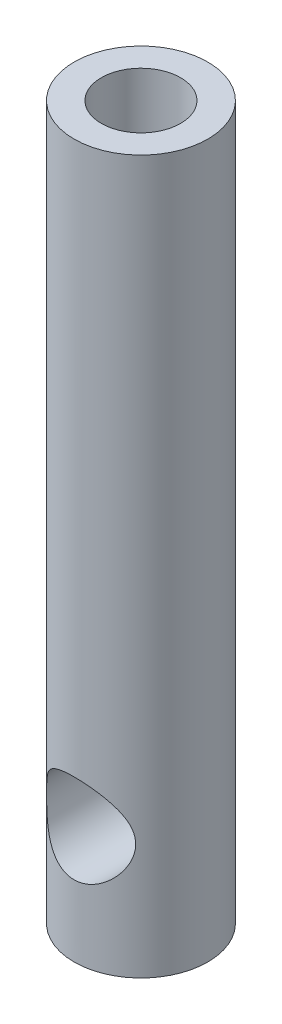
ISO-10303-21;
HEADER;
FILE_DESCRIPTION(('STEP AP214'),'2;1');
FILE_NAME('part.step','',(''),(''),'','','');
FILE_SCHEMA(('AUTOMOTIVE_DESIGN { 1 0 10303 214 1 1 1 1 }'));
ENDSEC;
DATA;
#1=APPLICATION_CONTEXT('core data for automotive mechanical design processes');
#2=APPLICATION_PROTOCOL_DEFINITION('international standard','automotive_design',2000,#1);
#3=PRODUCT_CONTEXT('',#1,'mechanical');
#4=PRODUCT('Part','Part','',(#3));
#5=PRODUCT_RELATED_PRODUCT_CATEGORY('part','',(#4));
#6=PRODUCT_DEFINITION_FORMATION('','',#4);
#7=PRODUCT_DEFINITION_CONTEXT('part definition',#1,'design');
#8=PRODUCT_DEFINITION('design','',#6,#7);
#9=PRODUCT_DEFINITION_SHAPE('','',#8);
#10=(LENGTH_UNIT() NAMED_UNIT(*) SI_UNIT(.MILLI.,.METRE.));
#11=(NAMED_UNIT(*) PLANE_ANGLE_UNIT() SI_UNIT($,.RADIAN.));
#12=(NAMED_UNIT(*) SI_UNIT($,.STERADIAN.) SOLID_ANGLE_UNIT());
#13=UNCERTAINTY_MEASURE_WITH_UNIT(LENGTH_MEASURE(1.E-05),#10,'distance_accuracy_value','');
#14=(GEOMETRIC_REPRESENTATION_CONTEXT(3) GLOBAL_UNCERTAINTY_ASSIGNED_CONTEXT((#13)) GLOBAL_UNIT_ASSIGNED_CONTEXT((#10,
#11,#12)) REPRESENTATION_CONTEXT('',''));
#15=CARTESIAN_POINT('',(0.,0.,0.));
#16=DIRECTION('',(0.,0.,1.));
#17=DIRECTION('',(1.,0.,0.));
#18=AXIS2_PLACEMENT_3D('',#15,#16,#17);
#19=CARTESIAN_POINT('',(0.,-20.32,0.));
#20=DIRECTION('',(0.,1.,0.));
#21=DIRECTION('',(0.,0.,1.));
#22=AXIS2_PLACEMENT_3D('',#19,#20,#21);
#23=CYLINDRICAL_SURFACE('',#22,1.905);
#24=CARTESIAN_POINT('',(0.,-15.748,-1.905));
#25=CARTESIAN_POINT('',(0.0638077950842613,-15.7479996509834,-1.90500026444466));
#26=CARTESIAN_POINT('',(0.127615370329401,-15.7528348709217,-1.901766597484));
#27=CARTESIAN_POINT('',(0.253195491850109,-15.7718740087071,-1.8891545428912));
#28=CARTESIAN_POINT('',(0.314967057361427,-15.7860823743833,-1.87977323804085));
#29=CARTESIAN_POINT('',(0.43447481548745,-15.8229984005013,-1.85579056326989));
#30=CARTESIAN_POINT('',(0.492228424137546,-15.845666263905,-1.84121364988255));
#31=CARTESIAN_POINT('',(0.602878709783258,-15.8985352356774,-1.80801097552175));
#32=CARTESIAN_POINT('',(0.655774680072138,-15.9287374378009,-1.78938462674499));
#33=CARTESIAN_POINT('',(0.760275784989019,-15.9986071552283,-1.74769354149847));
#34=CARTESIAN_POINT('',(0.811390493967528,-16.0388603915717,-1.72438629962868));
#35=CARTESIAN_POINT('',(0.906607308379888,-16.1262885808981,-1.67628768808001));
#36=CARTESIAN_POINT('',(0.950699175203688,-16.173473450447,-1.65149422276588));
#37=CARTESIAN_POINT('',(1.0377315906839,-16.282068253434,-1.59847448071035));
#38=CARTESIAN_POINT('',(1.07939323340347,-16.3445479897842,-1.57032368140502));
#39=CARTESIAN_POINT('',(1.15157476704,-16.4772107448056,-1.51818433569038));
#40=CARTESIAN_POINT('',(1.18211392625827,-16.5473801649924,-1.49418862931205));
#41=CARTESIAN_POINT('',(1.22348012232265,-16.6730116713227,-1.46034929317334));
#42=CARTESIAN_POINT('',(1.2374527399487,-16.7268705675749,-1.44841993711697));
#43=CARTESIAN_POINT('',(1.25825642293615,-16.836862760511,-1.43038810733828));
#44=CARTESIAN_POINT('',(1.26509979803977,-16.8929919624413,-1.42427559152457));
#45=CARTESIAN_POINT('',(1.27121516229699,-17.0062364845737,-1.41882244561186));
#46=CARTESIAN_POINT('',(1.27045620252702,-17.0633548898915,-1.41950949624937));
#47=CARTESIAN_POINT('',(1.26134864146607,-17.1765182081731,-1.42760557431686));
#48=CARTESIAN_POINT('',(1.25299361021273,-17.2325621705907,-1.43502029661092));
#49=CARTESIAN_POINT('',(1.22977271328266,-17.3396065775359,-1.45495763104655));
#50=CARTESIAN_POINT('',(1.21521036790435,-17.3907204483111,-1.46724045089744));
#51=CARTESIAN_POINT('',(1.18027525299507,-17.4898200437796,-1.49548610559083));
#52=CARTESIAN_POINT('',(1.15990057150023,-17.5378047327388,-1.51145015103813));
#53=CARTESIAN_POINT('',(1.10917874899687,-17.6396811260042,-1.54917264716809));
#54=CARTESIAN_POINT('',(1.07764613228768,-17.6927890366195,-1.57144921834124));
#55=CARTESIAN_POINT('',(1.00754789896739,-17.7935784558147,-1.61729126531554));
#56=CARTESIAN_POINT('',(0.96897360820123,-17.8412531526232,-1.64085830541102));
#57=CARTESIAN_POINT('',(0.876180399730834,-17.9403645165266,-1.69255023264861));
#58=CARTESIAN_POINT('',(0.820381508083714,-17.9903971209317,-1.72056262890881));
#59=CARTESIAN_POINT('',(0.699775079433338,-18.0804797740138,-1.77303493929078));
#60=CARTESIAN_POINT('',(0.634976060087458,-18.1205391623303,-1.79749816808112));
#61=CARTESIAN_POINT('',(0.511084720202913,-18.182258351329,-1.83607331596091));
#62=CARTESIAN_POINT('',(0.453363103540257,-18.2059855357212,-1.85127430839772));
#63=CARTESIAN_POINT('',(0.334032887899938,-18.2448866277712,-1.87647401584712));
#64=CARTESIAN_POINT('',(0.272427623166293,-18.2600677642287,-1.88647712701082));
#65=CARTESIAN_POINT('',(0.146675762764153,-18.2811173399264,-1.90040185169481));
#66=CARTESIAN_POINT('',(0.0825194005781194,-18.2869455576959,-1.90429719762831));
#67=CARTESIAN_POINT('',(-0.0460003648121637,-18.2887919012369,-1.90552778002891));
#68=CARTESIAN_POINT('',(-0.110363753228468,-18.2848107128104,-1.90286347509875));
#69=CARTESIAN_POINT('',(-0.232699380424727,-18.2679187247182,-1.89166239284415));
#70=CARTESIAN_POINT('',(-0.290802977371363,-18.2556548159254,-1.88355126457821));
#71=CARTESIAN_POINT('',(-0.403933909191323,-18.2234867393819,-1.86257215295844));
#72=CARTESIAN_POINT('',(-0.458960751857401,-18.2035813531608,-1.84970341099228));
#73=CARTESIAN_POINT('',(-0.568112116546192,-18.1555057913762,-1.81925183856131));
#74=CARTESIAN_POINT('',(-0.621980077242037,-18.126908022157,-1.80143067536671));
#75=CARTESIAN_POINT('',(-0.724333720211794,-18.0629348608852,-1.76277178312862));
#76=CARTESIAN_POINT('',(-0.772816049103514,-18.027555283066,-1.74193219304827));
#77=CARTESIAN_POINT('',(-0.871127578817461,-17.9447140037154,-1.69516137126868));
#78=CARTESIAN_POINT('',(-0.919957441085586,-17.8962264248339,-1.66894609575877));
#79=CARTESIAN_POINT('',(-1.00923069722214,-17.7919942419956,-1.61652694901805));
#80=CARTESIAN_POINT('',(-1.04966829465265,-17.7362446652358,-1.59032309806151));
#81=CARTESIAN_POINT('',(-1.11839233114935,-17.6230645678349,-1.54266696173277));
#82=CARTESIAN_POINT('',(-1.14741728962158,-17.5661751585372,-1.521000242076));
#83=CARTESIAN_POINT('',(-1.19695095747284,-17.447340865484,-1.48233748753033));
#84=CARTESIAN_POINT('',(-1.2174749951364,-17.3854053241189,-1.46533306479118));
#85=CARTESIAN_POINT('',(-1.24609760596226,-17.2691015506699,-1.44102587177196));
#86=CARTESIAN_POINT('',(-1.25576709453533,-17.2153759007396,-1.43252823738757));
#87=CARTESIAN_POINT('',(-1.26808995762361,-17.106535966352,-1.42163461193119));
#88=CARTESIAN_POINT('',(-1.27075095280995,-17.051423256022,-1.41923199356064));
#89=CARTESIAN_POINT('',(-1.26888190458285,-16.9413916589849,-1.42090267730038));
#90=CARTESIAN_POINT('',(-1.26434760319287,-16.8864729063345,-1.42497981395179));
#91=CARTESIAN_POINT('',(-1.24839093235966,-16.7783868593752,-1.43897637272272));
#92=CARTESIAN_POINT('',(-1.23695937340632,-16.7252220016984,-1.44890358874045));
#93=CARTESIAN_POINT('',(-1.20391577651251,-16.6079733966178,-1.47654545899703));
#94=CARTESIAN_POINT('',(-1.18040268864633,-16.5447550024107,-1.49563031905345));
#95=CARTESIAN_POINT('',(-1.12448674197309,-16.4239658602965,-1.53811072399034));
#96=CARTESIAN_POINT('',(-1.09207140206748,-16.3664031968101,-1.56151230574591));
#97=CARTESIAN_POINT('',(-1.01852908142221,-16.256456001632,-1.61046913452551));
#98=CARTESIAN_POINT('',(-0.977254267799305,-16.2041847966465,-1.6360558298766));
#99=CARTESIAN_POINT('',(-0.886915727025181,-16.106570226316,-1.68673971482971));
#100=CARTESIAN_POINT('',(-0.837849613521386,-16.0612289918892,-1.71183675180403));
#101=CARTESIAN_POINT('',(-0.724825404394763,-15.9723378137605,-1.76296035495098));
#102=CARTESIAN_POINT('',(-0.659740660165501,-15.9299791634859,-1.78860326460188));
#103=CARTESIAN_POINT('',(-0.521251532917109,-15.8572750693184,-1.83373817830648));
#104=CARTESIAN_POINT('',(-0.447860459655775,-15.826910747167,-1.85323983837868));
#105=CARTESIAN_POINT('',(-0.312061269345254,-15.7853668428658,-1.88024544471326));
#106=CARTESIAN_POINT('',(-0.250832826538658,-15.7714244901723,-1.88945190034246));
#107=CARTESIAN_POINT('',(-0.126401837635321,-15.7527446993384,-1.90182677890104));
#108=CARTESIAN_POINT('',(-0.0632008109794154,-15.7480003456965,-1.90499973807092));
#109=CARTESIAN_POINT('',(0.,-15.748,-1.905));
#110=B_SPLINE_CURVE_WITH_KNOTS('',3,(#24,#25,#26,#27,#28,#29,#30,#31,#32,#33,#34,#35,#36,#37,
#38,#39,#40,#41,#42,#43,#44,#45,#46,#47,#48,#49,#50,#51,#52,#53,#54,#55,#56,#57,#58,#59,#60,#61,
#62,#63,#64,#65,#66,#67,#68,#69,#70,#71,#72,#73,#74,#75,#76,#77,#78,#79,#80,#81,#82,#83,#84,#85,
#86,#87,#88,#89,#90,#91,#92,#93,#94,#95,#96,#97,#98,#99,#100,#101,#102,#103,#104,#105,#106,#107,
#108,#109),.UNSPECIFIED.,.T.,.F.,(4,2,2,2,2,2,2,2,2,2,2,2,2,2,2,2,2,2,2,2,2,2,2,2,2,2,2,2,2,2,2,
2,2,2,2,2,2,2,2,2,2,2,4),(0.,0.191168798830928,0.382428378111417,0.572799307275795,
0.763197888557904,0.969753134153534,1.17660681368742,1.41609243892949,1.65516118957854,
1.82520395484279,1.99495262582089,2.16539261951965,2.33597702262229,2.49903527495744,
2.66214722716225,2.85843709908842,3.054970418993,3.29386536104401,3.53253573590329,
3.72442795686405,3.9161576181465,4.10870960890813,4.30124813822682,4.48026208842184,
4.65930459511766,4.84919240235707,5.03919778889168,5.25924891848684,5.4794515326557,
5.6810270891512,5.88223757910439,6.04725770483825,6.21209832205093,6.37703652374267,
6.54219496639853,6.75136196519434,6.96082372986886,7.17409820696733,7.38743813312932,
7.63140048231742,7.8749773065801,8.06447010009769,8.2538203684171),.UNSPECIFIED.);
#111=CARTESIAN_POINT('',(0.,-15.748,-1.905));
#112=VERTEX_POINT('',#111);
#113=EDGE_CURVE('E11',#112,#112,#110,.T.);
#114=ORIENTED_EDGE('',*,*,#113,.F.);
#115=EDGE_LOOP('',(#114));
#116=FACE_BOUND('',#115,.T.);
#117=CARTESIAN_POINT('',(0.,-18.288,1.905));
#118=CARTESIAN_POINT('',(0.0638077950842613,-18.2880003490166,1.90500026444466));
#119=CARTESIAN_POINT('',(0.127615370329401,-18.2831651290783,1.901766597484));
#120=CARTESIAN_POINT('',(0.253195491850109,-18.2641259912929,1.8891545428912));
#121=CARTESIAN_POINT('',(0.314967057361427,-18.2499176256167,1.87977323804085));
#122=CARTESIAN_POINT('',(0.434474815487452,-18.2130015994987,1.85579056326989));
#123=CARTESIAN_POINT('',(0.492228424137549,-18.190333736095,1.84121364988255));
#124=CARTESIAN_POINT('',(0.602878709783261,-18.1374647643226,1.80801097552175));
#125=CARTESIAN_POINT('',(0.65577468007214,-18.1072625621991,1.78938462674499));
#126=CARTESIAN_POINT('',(0.760275784989019,-18.0373928447717,1.74769354149847));
#127=CARTESIAN_POINT('',(0.811390493967528,-17.9971396084283,1.72438629962868));
#128=CARTESIAN_POINT('',(0.906607308379888,-17.9097114191019,1.67628768808001));
#129=CARTESIAN_POINT('',(0.950699175203688,-17.862526549553,1.65149422276588));
#130=CARTESIAN_POINT('',(1.0377315906839,-17.753931746566,1.59847448071035));
#131=CARTESIAN_POINT('',(1.07939323340347,-17.6914520102158,1.57032368140502));
#132=CARTESIAN_POINT('',(1.15157476704,-17.5587892551944,1.51818433569038));
#133=CARTESIAN_POINT('',(1.18211392625827,-17.4886198350076,1.49418862931205));
#134=CARTESIAN_POINT('',(1.22348012232265,-17.3629883286773,1.46034929317334));
#135=CARTESIAN_POINT('',(1.2374527399487,-17.3091294324251,1.44841993711697));
#136=CARTESIAN_POINT('',(1.25825642293615,-17.199137239489,1.43038810733828));
#137=CARTESIAN_POINT('',(1.26509979803977,-17.1430080375588,1.42427559152457));
#138=CARTESIAN_POINT('',(1.27121516229699,-17.0297635154263,1.41882244561186));
#139=CARTESIAN_POINT('',(1.27045620252702,-16.9726451101085,1.41950949624937));
#140=CARTESIAN_POINT('',(1.26134864146607,-16.8594817918269,1.42760557431686));
#141=CARTESIAN_POINT('',(1.25299361021273,-16.8034378294093,1.43502029661092));
#142=CARTESIAN_POINT('',(1.22977271328266,-16.6963934224641,1.45495763104655));
#143=CARTESIAN_POINT('',(1.21521036790435,-16.6452795516889,1.46724045089744));
#144=CARTESIAN_POINT('',(1.18027525299507,-16.5461799562204,1.49548610559083));
#145=CARTESIAN_POINT('',(1.15990057150023,-16.4981952672612,1.51145015103813));
#146=CARTESIAN_POINT('',(1.10917874899687,-16.3963188739958,1.54917264716809));
#147=CARTESIAN_POINT('',(1.07764613228768,-16.3432109633805,1.57144921834124));
#148=CARTESIAN_POINT('',(1.00754789896739,-16.2424215441853,1.61729126531554));
#149=CARTESIAN_POINT('',(0.96897360820123,-16.1947468473768,1.64085830541102));
#150=CARTESIAN_POINT('',(0.876180399730834,-16.0956354834734,1.69255023264861));
#151=CARTESIAN_POINT('',(0.820381508083715,-16.0456028790683,1.72056262890881));
#152=CARTESIAN_POINT('',(0.699775079433339,-15.9555202259862,1.77303493929078));
#153=CARTESIAN_POINT('',(0.634976060087459,-15.9154608376697,1.79749816808112));
#154=CARTESIAN_POINT('',(0.511084720202914,-15.853741648671,1.83607331596091));
#155=CARTESIAN_POINT('',(0.453363103540258,-15.8300144642788,1.85127430839772));
#156=CARTESIAN_POINT('',(0.334032887899938,-15.7911133722288,1.87647401584712));
#157=CARTESIAN_POINT('',(0.272427623166294,-15.7759322357713,1.88647712701082));
#158=CARTESIAN_POINT('',(0.146675762764153,-15.7548826600736,1.90040185169481));
#159=CARTESIAN_POINT('',(0.0825194005781204,-15.7490544423041,1.90429719762831));
#160=CARTESIAN_POINT('',(-0.0460003648121628,-15.7472080987631,1.90552778002891));
#161=CARTESIAN_POINT('',(-0.110363753228468,-15.7511892871896,1.90286347509875));
#162=CARTESIAN_POINT('',(-0.232699380424726,-15.7680812752818,1.89166239284416));
#163=CARTESIAN_POINT('',(-0.290802977371362,-15.7803451840746,1.88355126457821));
#164=CARTESIAN_POINT('',(-0.403933909191323,-15.8125132606181,1.86257215295844));
#165=CARTESIAN_POINT('',(-0.458960751857401,-15.8324186468392,1.84970341099228));
#166=CARTESIAN_POINT('',(-0.568112116546192,-15.8804942086238,1.81925183856131));
#167=CARTESIAN_POINT('',(-0.621980077242037,-15.909091977843,1.80143067536671));
#168=CARTESIAN_POINT('',(-0.724333720211794,-15.9730651391148,1.76277178312862));
#169=CARTESIAN_POINT('',(-0.772816049103514,-16.008444716934,1.74193219304827));
#170=CARTESIAN_POINT('',(-0.871127578817461,-16.0912859962846,1.69516137126868));
#171=CARTESIAN_POINT('',(-0.919957441085586,-16.1397735751661,1.66894609575877));
#172=CARTESIAN_POINT('',(-1.00923069722214,-16.2440057580044,1.61652694901805));
#173=CARTESIAN_POINT('',(-1.04966829465265,-16.2997553347642,1.59032309806151));
#174=CARTESIAN_POINT('',(-1.11839233114935,-16.4129354321651,1.54266696173277));
#175=CARTESIAN_POINT('',(-1.14741728962158,-16.4698248414628,1.521000242076));
#176=CARTESIAN_POINT('',(-1.19695095747284,-16.588659134516,1.48233748753033));
#177=CARTESIAN_POINT('',(-1.2174749951364,-16.6505946758811,1.46533306479118));
#178=CARTESIAN_POINT('',(-1.24609760596226,-16.7668984493301,1.44102587177196));
#179=CARTESIAN_POINT('',(-1.25576709453533,-16.8206240992604,1.43252823738757));
#180=CARTESIAN_POINT('',(-1.26808995762361,-16.929464033648,1.42163461193119));
#181=CARTESIAN_POINT('',(-1.27075095280995,-16.984576743978,1.41923199356064));
#182=CARTESIAN_POINT('',(-1.26888190458285,-17.0946083410151,1.42090267730038));
#183=CARTESIAN_POINT('',(-1.26434760319287,-17.1495270936655,1.42497981395178));
#184=CARTESIAN_POINT('',(-1.24839093235966,-17.2576131406248,1.43897637272272));
#185=CARTESIAN_POINT('',(-1.23695937340632,-17.3107779983016,1.44890358874045));
#186=CARTESIAN_POINT('',(-1.20391577651251,-17.4280266033822,1.47654545899703));
#187=CARTESIAN_POINT('',(-1.18040268864633,-17.4912449975893,1.49563031905345));
#188=CARTESIAN_POINT('',(-1.12448674197309,-17.6120341397035,1.53811072399034));
#189=CARTESIAN_POINT('',(-1.09207140206749,-17.6695968031899,1.56151230574591));
#190=CARTESIAN_POINT('',(-1.01852908142222,-17.779543998368,1.61046913452551));
#191=CARTESIAN_POINT('',(-0.977254267799308,-17.8318152033535,1.63605582987659));
#192=CARTESIAN_POINT('',(-0.886915727025186,-17.929429773684,1.68673971482971));
#193=CARTESIAN_POINT('',(-0.837849613521393,-17.9747710081108,1.71183675180403));
#194=CARTESIAN_POINT('',(-0.724825404394772,-18.0636621862395,1.76296035495098));
#195=CARTESIAN_POINT('',(-0.65974066016551,-18.1060208365141,1.78860326460188));
#196=CARTESIAN_POINT('',(-0.521251532917118,-18.1787249306816,1.83373817830647));
#197=CARTESIAN_POINT('',(-0.447860459655784,-18.209089252833,1.85323983837868));
#198=CARTESIAN_POINT('',(-0.312061269345262,-18.2506331571342,1.88024544471326));
#199=CARTESIAN_POINT('',(-0.250832826538666,-18.2645755098277,1.88945190034246));
#200=CARTESIAN_POINT('',(-0.126401837635326,-18.2832553006617,1.90182677890104));
#201=CARTESIAN_POINT('',(-0.063200810979418,-18.2879996543035,1.90499973807092));
#202=CARTESIAN_POINT('',(0.,-18.288,1.905));
#203=B_SPLINE_CURVE_WITH_KNOTS('',3,(#117,#118,#119,#120,#121,#122,#123,#124,#125,#126,#127,
#128,#129,#130,#131,#132,#133,#134,#135,#136,#137,#138,#139,#140,#141,#142,#143,#144,#145,#146,
#147,#148,#149,#150,#151,#152,#153,#154,#155,#156,#157,#158,#159,#160,#161,#162,#163,#164,#165,
#166,#167,#168,#169,#170,#171,#172,#173,#174,#175,#176,#177,#178,#179,#180,#181,#182,#183,#184,
#185,#186,#187,#188,#189,#190,#191,#192,#193,#194,#195,#196,#197,#198,#199,#200,#201,#202),
.UNSPECIFIED.,.T.,.F.,(4,2,2,2,2,2,2,2,2,2,2,2,2,2,2,2,2,2,2,2,2,2,2,2,2,2,2,2,2,2,2,2,2,2,2,2,
2,2,2,2,2,2,4),(0.,0.191168798830928,0.382428378111417,0.572799307275801,0.763197888557904,
0.969753134153534,1.17660681368742,1.41609243892949,1.65516118957854,1.82520395484279,
1.99495262582089,2.16539261951965,2.33597702262229,2.49903527495744,2.66214722716225,
2.85843709908842,3.054970418993,3.29386536104401,3.53253573590329,3.72442795686405,
3.9161576181465,4.10870960890813,4.30124813822682,4.48026208842184,4.65930459511765,
4.84919240235707,5.03919778889168,5.25924891848684,5.4794515326557,5.6810270891512,
5.88223757910439,6.04725770483825,6.21209832205092,6.37703652374266,6.54219496639853,
6.75136196519433,6.96082372986885,7.17409820696732,7.38743813312931,7.6314004823174,
7.87497730658009,8.06447010009768,8.2538203684171),.UNSPECIFIED.);
#204=CARTESIAN_POINT('',(0.,-18.288,1.905));
#205=VERTEX_POINT('',#204);
#206=EDGE_CURVE('E47',#205,#205,#203,.T.);
#207=ORIENTED_EDGE('',*,*,#206,.F.);
#208=EDGE_LOOP('',(#207));
#209=FACE_BOUND('',#208,.T.);
#210=CARTESIAN_POINT('',(0.,-20.32,0.));
#211=DIRECTION('',(0.,1.,0.));
#212=DIRECTION('',(0.,0.,1.));
#213=AXIS2_PLACEMENT_3D('',#210,#211,#212);
#214=CIRCLE('',#213,1.905);
#215=CARTESIAN_POINT('',(0.,-20.32,1.905));
#216=VERTEX_POINT('',#215);
#217=EDGE_CURVE('E64',#216,#216,#214,.T.);
#218=ORIENTED_EDGE('',*,*,#217,.T.);
#219=EDGE_LOOP('',(#218));
#220=FACE_BOUND('',#219,.T.);
#221=CARTESIAN_POINT('',(0.,0.,0.));
#222=DIRECTION('',(0.,1.,0.));
#223=DIRECTION('',(0.,0.,1.));
#224=AXIS2_PLACEMENT_3D('',#221,#222,#223);
#225=CIRCLE('',#224,1.905);
#226=CARTESIAN_POINT('',(0.,0.,1.905));
#227=VERTEX_POINT('',#226);
#228=EDGE_CURVE('E60',#227,#227,#225,.T.);
#229=ORIENTED_EDGE('',*,*,#228,.F.);
#230=EDGE_LOOP('',(#229));
#231=FACE_BOUND('',#230,.T.);
#232=ADVANCED_FACE('F37',(#116,#209,#220,#231),#23,.T.);
#233=CARTESIAN_POINT('',(0.,-20.32,0.));
#234=DIRECTION('',(0.,1.,0.));
#235=DIRECTION('',(0.,0.,1.));
#236=AXIS2_PLACEMENT_3D('',#233,#234,#235);
#237=PLANE('',#236);
#238=ORIENTED_EDGE('',*,*,#217,.F.);
#239=EDGE_LOOP('',(#238));
#240=FACE_BOUND('',#239,.T.);
#241=ADVANCED_FACE('F81',(#240),#237,.F.);
#242=CARTESIAN_POINT('',(0.,0.,0.));
#243=DIRECTION('',(0.,1.,0.));
#244=DIRECTION('',(0.,0.,1.));
#245=AXIS2_PLACEMENT_3D('',#242,#243,#244);
#246=PLANE('',#245);
#247=CARTESIAN_POINT('',(0.,0.,0.));
#248=DIRECTION('',(0.,1.,0.));
#249=DIRECTION('',(0.,0.,1.));
#250=AXIS2_PLACEMENT_3D('',#247,#248,#249);
#251=CIRCLE('',#250,1.13029999999999);
#252=CARTESIAN_POINT('',(0.,0.,1.13029999999999));
#253=VERTEX_POINT('',#252);
#254=EDGE_CURVE('E61',#253,#253,#251,.T.);
#255=ORIENTED_EDGE('',*,*,#254,.F.);
#256=EDGE_LOOP('',(#255));
#257=FACE_BOUND('',#256,.T.);
#258=ORIENTED_EDGE('',*,*,#228,.T.);
#259=EDGE_LOOP('',(#258));
#260=FACE_BOUND('',#259,.T.);
#261=ADVANCED_FACE('F54',(#257,#260),#246,.T.);
#262=CARTESIAN_POINT('',(0.,-7.62,0.));
#263=DIRECTION('',(0.,1.,0.));
#264=DIRECTION('',(0.,0.,1.));
#265=AXIS2_PLACEMENT_3D('',#262,#263,#264);
#266=CONICAL_SURFACE('',#265,1.13029999999999,1.02974425867665);
#267=CARTESIAN_POINT('',(0.,-8.29915275768685,0.));
#268=VERTEX_POINT('',#267);
#269=VERTEX_LOOP('',#268);
#270=FACE_BOUND('',#269,.T.);
#271=CARTESIAN_POINT('',(0.,-7.62,0.));
#272=DIRECTION('',(0.,1.,0.));
#273=DIRECTION('',(0.,0.,1.));
#274=AXIS2_PLACEMENT_3D('',#271,#272,#273);
#275=CIRCLE('',#274,1.13029999999999);
#276=CARTESIAN_POINT('',(0.,-7.62,1.13029999999999));
#277=VERTEX_POINT('',#276);
#278=EDGE_CURVE('E58',#277,#277,#275,.T.);
#279=ORIENTED_EDGE('',*,*,#278,.T.);
#280=EDGE_LOOP('',(#279));
#281=FACE_BOUND('',#280,.T.);
#282=ADVANCED_FACE('F50',(#270,#281),#266,.F.);
#283=CARTESIAN_POINT('',(0.,0.,0.));
#284=DIRECTION('',(0.,1.,0.));
#285=DIRECTION('',(0.,0.,1.));
#286=AXIS2_PLACEMENT_3D('',#283,#284,#285);
#287=CYLINDRICAL_SURFACE('',#286,1.13029999999999);
#288=ORIENTED_EDGE('',*,*,#278,.F.);
#289=EDGE_LOOP('',(#288));
#290=FACE_BOUND('',#289,.T.);
#291=ORIENTED_EDGE('',*,*,#254,.T.);
#292=EDGE_LOOP('',(#291));
#293=FACE_BOUND('',#292,.T.);
#294=ADVANCED_FACE('F53',(#290,#293),#287,.F.);
#295=CARTESIAN_POINT('',(0.,-17.018,-1.905));
#296=DIRECTION('',(0.,0.,1.));
#297=DIRECTION('',(1.,0.,0.));
#298=AXIS2_PLACEMENT_3D('',#295,#296,#297);
#299=CYLINDRICAL_SURFACE('',#298,1.27);
#300=ORIENTED_EDGE('',*,*,#206,.T.);
#301=EDGE_LOOP('',(#300));
#302=FACE_BOUND('',#301,.T.);
#303=ORIENTED_EDGE('',*,*,#113,.T.);
#304=EDGE_LOOP('',(#303));
#305=FACE_BOUND('',#304,.T.);
#306=ADVANCED_FACE('F73',(#302,#305),#299,.F.);
#307=CLOSED_SHELL('',(#232,#241,#261,#282,#294,#306));
#308=MANIFOLD_SOLID_BREP('B2',#307);
#309=ADVANCED_BREP_SHAPE_REPRESENTATION('',(#18,#308),#14);
#310=SHAPE_DEFINITION_REPRESENTATION(#9,#309);
ENDSEC;
END-ISO-10303-21;
